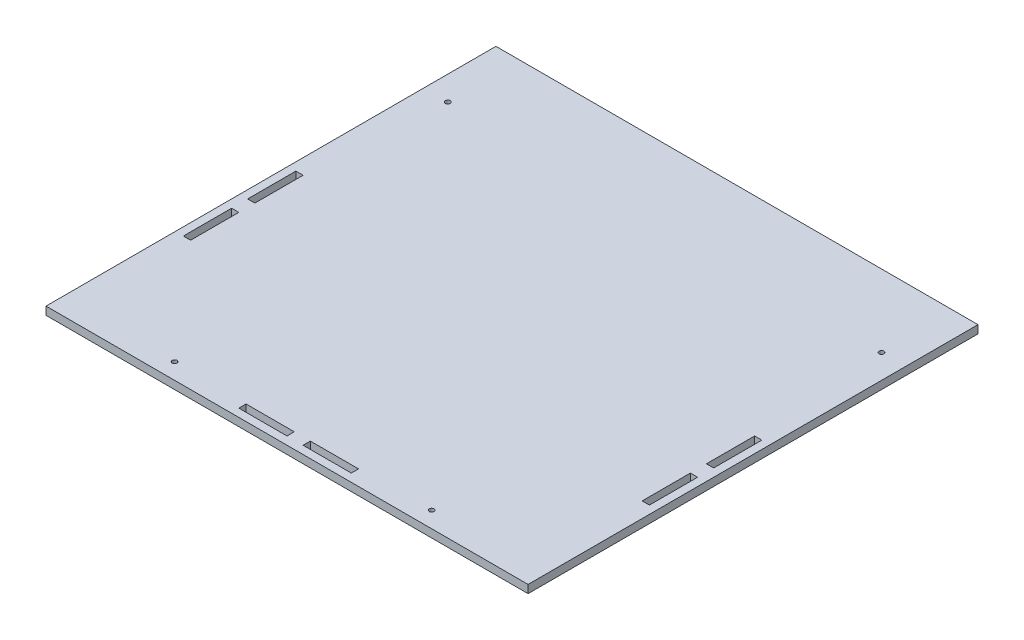
ISO-10303-21;
HEADER;
FILE_DESCRIPTION(('STEP AP214'),'2;1');
FILE_NAME('part.step','',(''),(''),'','','');
FILE_SCHEMA(('AUTOMOTIVE_DESIGN { 1 0 10303 214 1 1 1 1 }'));
ENDSEC;
DATA;
#1=APPLICATION_CONTEXT('core data for automotive mechanical design processes');
#2=APPLICATION_PROTOCOL_DEFINITION('international standard','automotive_design',2000,#1);
#3=PRODUCT_CONTEXT('',#1,'mechanical');
#4=PRODUCT('Part','Part','',(#3));
#5=PRODUCT_RELATED_PRODUCT_CATEGORY('part','',(#4));
#6=PRODUCT_DEFINITION_FORMATION('','',#4);
#7=PRODUCT_DEFINITION_CONTEXT('part definition',#1,'design');
#8=PRODUCT_DEFINITION('design','',#6,#7);
#9=PRODUCT_DEFINITION_SHAPE('','',#8);
#10=(LENGTH_UNIT() NAMED_UNIT(*) SI_UNIT(.MILLI.,.METRE.));
#11=(NAMED_UNIT(*) PLANE_ANGLE_UNIT() SI_UNIT($,.RADIAN.));
#12=(NAMED_UNIT(*) SI_UNIT($,.STERADIAN.) SOLID_ANGLE_UNIT());
#13=UNCERTAINTY_MEASURE_WITH_UNIT(LENGTH_MEASURE(1.E-05),#10,'distance_accuracy_value','');
#14=(GEOMETRIC_REPRESENTATION_CONTEXT(3) GLOBAL_UNCERTAINTY_ASSIGNED_CONTEXT((#13)) GLOBAL_UNIT_ASSIGNED_CONTEXT((#10,
#11,#12)) REPRESENTATION_CONTEXT('',''));
#15=CARTESIAN_POINT('',(0.,0.,0.));
#16=DIRECTION('',(0.,0.,1.));
#17=DIRECTION('',(1.,0.,0.));
#18=AXIS2_PLACEMENT_3D('',#15,#16,#17);
#19=CARTESIAN_POINT('',(0.,5.,0.));
#20=DIRECTION('',(0.,-1.,0.));
#21=DIRECTION('',(0.,0.,-1.));
#22=AXIS2_PLACEMENT_3D('',#19,#20,#21);
#23=PLANE('',#22);
#24=DIRECTION('',(0.,0.,-1.));
#25=VECTOR('',#24,1.);
#26=CARTESIAN_POINT('',(-140.5,5.,29.5));
#27=LINE('',#26,#25);
#28=CARTESIAN_POINT('',(-140.5,5.,59.5));
#29=VERTEX_POINT('',#28);
#30=CARTESIAN_POINT('',(-140.5,5.,29.5));
#31=VERTEX_POINT('',#30);
#32=EDGE_CURVE('E273',#29,#31,#27,.T.);
#33=ORIENTED_EDGE('',*,*,#32,.F.);
#34=DIRECTION('',(1.,0.,0.));
#35=VECTOR('',#34,1.);
#36=CARTESIAN_POINT('',(-140.5,5.,59.5));
#37=LINE('',#36,#35);
#38=CARTESIAN_POINT('',(-145.,5.,59.5));
#39=VERTEX_POINT('',#38);
#40=EDGE_CURVE('E284',#39,#29,#37,.T.);
#41=ORIENTED_EDGE('',*,*,#40,.F.);
#42=DIRECTION('',(0.,0.,1.));
#43=VECTOR('',#42,1.);
#44=CARTESIAN_POINT('',(-145.,5.,29.5));
#45=LINE('',#44,#43);
#46=CARTESIAN_POINT('',(-145.,5.,29.5));
#47=VERTEX_POINT('',#46);
#48=EDGE_CURVE('E280',#47,#39,#45,.T.);
#49=ORIENTED_EDGE('',*,*,#48,.F.);
#50=DIRECTION('',(-1.,0.,0.));
#51=VECTOR('',#50,1.);
#52=CARTESIAN_POINT('',(-140.5,5.,29.5));
#53=LINE('',#52,#51);
#54=EDGE_CURVE('E276',#31,#47,#53,.T.);
#55=ORIENTED_EDGE('',*,*,#54,.F.);
#56=EDGE_LOOP('',(#33,#41,#49,#55));
#57=FACE_BOUND('',#56,.T.);
#58=DIRECTION('',(0.,0.,1.));
#59=VECTOR('',#58,1.);
#60=CARTESIAN_POINT('',(140.5,5.,29.5));
#61=LINE('',#60,#59);
#62=CARTESIAN_POINT('',(140.5,5.,29.5));
#63=VERTEX_POINT('',#62);
#64=CARTESIAN_POINT('',(140.5,5.,59.5));
#65=VERTEX_POINT('',#64);
#66=EDGE_CURVE('E359',#63,#65,#61,.T.);
#67=ORIENTED_EDGE('',*,*,#66,.F.);
#68=DIRECTION('',(-1.,0.,0.));
#69=VECTOR('',#68,1.);
#70=CARTESIAN_POINT('',(140.5,5.,29.5));
#71=LINE('',#70,#69);
#72=CARTESIAN_POINT('',(145.,5.,29.5));
#73=VERTEX_POINT('',#72);
#74=EDGE_CURVE('E370',#73,#63,#71,.T.);
#75=ORIENTED_EDGE('',*,*,#74,.F.);
#76=DIRECTION('',(0.,0.,-1.));
#77=VECTOR('',#76,1.);
#78=CARTESIAN_POINT('',(145.,5.,29.5));
#79=LINE('',#78,#77);
#80=CARTESIAN_POINT('',(145.,5.,59.5));
#81=VERTEX_POINT('',#80);
#82=EDGE_CURVE('E366',#81,#73,#79,.T.);
#83=ORIENTED_EDGE('',*,*,#82,.F.);
#84=DIRECTION('',(1.,0.,0.));
#85=VECTOR('',#84,1.);
#86=CARTESIAN_POINT('',(140.5,5.,59.5));
#87=LINE('',#86,#85);
#88=EDGE_CURVE('E362',#65,#81,#87,.T.);
#89=ORIENTED_EDGE('',*,*,#88,.F.);
#90=EDGE_LOOP('',(#67,#75,#83,#89));
#91=FACE_BOUND('',#90,.T.);
#92=DIRECTION('',(0.,0.,1.));
#93=VECTOR('',#92,1.);
#94=CARTESIAN_POINT('',(5.,5.,130.5));
#95=LINE('',#94,#93);
#96=CARTESIAN_POINT('',(5.,5.,130.5));
#97=VERTEX_POINT('',#96);
#98=CARTESIAN_POINT('',(5.,5.,135.));
#99=VERTEX_POINT('',#98);
#100=EDGE_CURVE('E445',#97,#99,#95,.T.);
#101=ORIENTED_EDGE('',*,*,#100,.F.);
#102=DIRECTION('',(-1.,0.,0.));
#103=VECTOR('',#102,1.);
#104=CARTESIAN_POINT('',(5.,5.,130.5));
#105=LINE('',#104,#103);
#106=CARTESIAN_POINT('',(35.,5.,130.5));
#107=VERTEX_POINT('',#106);
#108=EDGE_CURVE('E456',#107,#97,#105,.T.);
#109=ORIENTED_EDGE('',*,*,#108,.F.);
#110=DIRECTION('',(0.,0.,-1.));
#111=VECTOR('',#110,1.);
#112=CARTESIAN_POINT('',(35.,5.,130.5));
#113=LINE('',#112,#111);
#114=CARTESIAN_POINT('',(35.,5.,135.));
#115=VERTEX_POINT('',#114);
#116=EDGE_CURVE('E452',#115,#107,#113,.T.);
#117=ORIENTED_EDGE('',*,*,#116,.F.);
#118=DIRECTION('',(1.,0.,0.));
#119=VECTOR('',#118,1.);
#120=CARTESIAN_POINT('',(5.,5.,135.));
#121=LINE('',#120,#119);
#122=EDGE_CURVE('E448',#99,#115,#121,.T.);
#123=ORIENTED_EDGE('',*,*,#122,.F.);
#124=EDGE_LOOP('',(#101,#109,#117,#123));
#125=FACE_BOUND('',#124,.T.);
#126=DIRECTION('',(0.,0.,-1.));
#127=VECTOR('',#126,1.);
#128=CARTESIAN_POINT('',(150.,5.,140.));
#129=LINE('',#128,#127);
#130=CARTESIAN_POINT('',(150.,5.,140.));
#131=VERTEX_POINT('',#130);
#132=CARTESIAN_POINT('',(150.,5.,-140.));
#133=VERTEX_POINT('',#132);
#134=EDGE_CURVE('E520',#131,#133,#129,.T.);
#135=ORIENTED_EDGE('',*,*,#134,.T.);
#136=DIRECTION('',(-1.,0.,0.));
#137=VECTOR('',#136,1.);
#138=CARTESIAN_POINT('',(-150.,5.,-140.));
#139=LINE('',#138,#137);
#140=CARTESIAN_POINT('',(-150.,5.,-140.));
#141=VERTEX_POINT('',#140);
#142=EDGE_CURVE('E524',#133,#141,#139,.T.);
#143=ORIENTED_EDGE('',*,*,#142,.T.);
#144=DIRECTION('',(0.,0.,1.));
#145=VECTOR('',#144,1.);
#146=CARTESIAN_POINT('',(-150.,5.,140.));
#147=LINE('',#146,#145);
#148=CARTESIAN_POINT('',(-150.,5.,140.));
#149=VERTEX_POINT('',#148);
#150=EDGE_CURVE('E528',#141,#149,#147,.T.);
#151=ORIENTED_EDGE('',*,*,#150,.T.);
#152=DIRECTION('',(1.,0.,0.));
#153=VECTOR('',#152,1.);
#154=CARTESIAN_POINT('',(-150.,5.,140.));
#155=LINE('',#154,#153);
#156=EDGE_CURVE('E531',#149,#131,#155,.T.);
#157=ORIENTED_EDGE('',*,*,#156,.T.);
#158=EDGE_LOOP('',(#135,#143,#151,#157));
#159=FACE_BOUND('',#158,.T.);
#160=CARTESIAN_POINT('',(-134.97,5.,-95.));
#161=DIRECTION('',(0.,1.,0.));
#162=DIRECTION('',(0.,0.,1.));
#163=AXIS2_PLACEMENT_3D('',#160,#161,#162);
#164=CIRCLE('',#163,1.5);
#165=CARTESIAN_POINT('',(-134.97,5.,-93.5));
#166=VERTEX_POINT('',#165);
#167=EDGE_CURVE('E512',#166,#166,#164,.T.);
#168=ORIENTED_EDGE('',*,*,#167,.F.);
#169=EDGE_LOOP('',(#168));
#170=FACE_BOUND('',#169,.T.);
#171=CARTESIAN_POINT('',(134.97,5.,-95.));
#172=DIRECTION('',(0.,1.,0.));
#173=DIRECTION('',(0.,0.,-1.));
#174=AXIS2_PLACEMENT_3D('',#171,#172,#173);
#175=CIRCLE('',#174,1.5);
#176=CARTESIAN_POINT('',(134.97,5.,-96.5));
#177=VERTEX_POINT('',#176);
#178=EDGE_CURVE('E504',#177,#177,#175,.T.);
#179=ORIENTED_EDGE('',*,*,#178,.F.);
#180=EDGE_LOOP('',(#179));
#181=FACE_BOUND('',#180,.T.);
#182=CARTESIAN_POINT('',(80.,5.,130.));
#183=DIRECTION('',(0.,1.,0.));
#184=DIRECTION('',(0.,0.,1.));
#185=AXIS2_PLACEMENT_3D('',#182,#183,#184);
#186=CIRCLE('',#185,1.5);
#187=CARTESIAN_POINT('',(80.,5.,131.5));
#188=VERTEX_POINT('',#187);
#189=EDGE_CURVE('E496',#188,#188,#186,.T.);
#190=ORIENTED_EDGE('',*,*,#189,.F.);
#191=EDGE_LOOP('',(#190));
#192=FACE_BOUND('',#191,.T.);
#193=CARTESIAN_POINT('',(-80.,5.,130.));
#194=DIRECTION('',(0.,1.,0.));
#195=DIRECTION('',(0.,0.,-1.));
#196=AXIS2_PLACEMENT_3D('',#193,#194,#195);
#197=CIRCLE('',#196,1.5);
#198=CARTESIAN_POINT('',(-80.,5.,128.5));
#199=VERTEX_POINT('',#198);
#200=EDGE_CURVE('E488',#199,#199,#197,.T.);
#201=ORIENTED_EDGE('',*,*,#200,.F.);
#202=EDGE_LOOP('',(#201));
#203=FACE_BOUND('',#202,.T.);
#204=DIRECTION('',(0.,0.,-1.));
#205=VECTOR('',#204,1.);
#206=CARTESIAN_POINT('',(-4.99999999999995,5.,130.5));
#207=LINE('',#206,#205);
#208=CARTESIAN_POINT('',(-4.99999999999995,5.,135.));
#209=VERTEX_POINT('',#208);
#210=CARTESIAN_POINT('',(-4.99999999999995,5.,130.5));
#211=VERTEX_POINT('',#210);
#212=EDGE_CURVE('E402',#209,#211,#207,.T.);
#213=ORIENTED_EDGE('',*,*,#212,.F.);
#214=DIRECTION('',(1.,0.,0.));
#215=VECTOR('',#214,1.);
#216=CARTESIAN_POINT('',(-4.99999999999995,5.,135.));
#217=LINE('',#216,#215);
#218=CARTESIAN_POINT('',(-35.,5.,135.));
#219=VERTEX_POINT('',#218);
#220=EDGE_CURVE('E413',#219,#209,#217,.T.);
#221=ORIENTED_EDGE('',*,*,#220,.F.);
#222=DIRECTION('',(0.,0.,1.));
#223=VECTOR('',#222,1.);
#224=CARTESIAN_POINT('',(-35.,5.,130.5));
#225=LINE('',#224,#223);
#226=CARTESIAN_POINT('',(-35.,5.,130.5));
#227=VERTEX_POINT('',#226);
#228=EDGE_CURVE('E409',#227,#219,#225,.T.);
#229=ORIENTED_EDGE('',*,*,#228,.F.);
#230=DIRECTION('',(-1.,0.,0.));
#231=VECTOR('',#230,1.);
#232=CARTESIAN_POINT('',(-4.99999999999995,5.,130.5));
#233=LINE('',#232,#231);
#234=EDGE_CURVE('E405',#211,#227,#233,.T.);
#235=ORIENTED_EDGE('',*,*,#234,.F.);
#236=EDGE_LOOP('',(#213,#221,#229,#235));
#237=FACE_BOUND('',#236,.T.);
#238=DIRECTION('',(0.,0.,1.));
#239=VECTOR('',#238,1.);
#240=CARTESIAN_POINT('',(140.5,5.,19.5));
#241=LINE('',#240,#239);
#242=CARTESIAN_POINT('',(140.5,5.,-10.5));
#243=VERTEX_POINT('',#242);
#244=CARTESIAN_POINT('',(140.5,5.,19.5));
#245=VERTEX_POINT('',#244);
#246=EDGE_CURVE('E316',#243,#245,#241,.T.);
#247=ORIENTED_EDGE('',*,*,#246,.F.);
#248=DIRECTION('',(-1.,0.,0.));
#249=VECTOR('',#248,1.);
#250=CARTESIAN_POINT('',(140.5,5.,-10.5));
#251=LINE('',#250,#249);
#252=CARTESIAN_POINT('',(145.,5.,-10.5));
#253=VERTEX_POINT('',#252);
#254=EDGE_CURVE('E327',#253,#243,#251,.T.);
#255=ORIENTED_EDGE('',*,*,#254,.F.);
#256=DIRECTION('',(0.,0.,-1.));
#257=VECTOR('',#256,1.);
#258=CARTESIAN_POINT('',(145.,5.,19.5));
#259=LINE('',#258,#257);
#260=CARTESIAN_POINT('',(145.,5.,19.5));
#261=VERTEX_POINT('',#260);
#262=EDGE_CURVE('E323',#261,#253,#259,.T.);
#263=ORIENTED_EDGE('',*,*,#262,.F.);
#264=DIRECTION('',(1.,0.,0.));
#265=VECTOR('',#264,1.);
#266=CARTESIAN_POINT('',(140.5,5.,19.5));
#267=LINE('',#266,#265);
#268=EDGE_CURVE('E319',#245,#261,#267,.T.);
#269=ORIENTED_EDGE('',*,*,#268,.F.);
#270=EDGE_LOOP('',(#247,#255,#263,#269));
#271=FACE_BOUND('',#270,.T.);
#272=DIRECTION('',(1.,0.,0.));
#273=VECTOR('',#272,1.);
#274=CARTESIAN_POINT('',(-140.5,5.,19.5));
#275=LINE('',#274,#273);
#276=CARTESIAN_POINT('',(-145.,5.,19.5));
#277=VERTEX_POINT('',#276);
#278=CARTESIAN_POINT('',(-140.5,5.,19.5));
#279=VERTEX_POINT('',#278);
#280=EDGE_CURVE('E225',#277,#279,#275,.T.);
#281=ORIENTED_EDGE('',*,*,#280,.F.);
#282=DIRECTION('',(0.,0.,1.));
#283=VECTOR('',#282,1.);
#284=CARTESIAN_POINT('',(-145.,5.,19.5));
#285=LINE('',#284,#283);
#286=CARTESIAN_POINT('',(-145.,5.,-10.5));
#287=VERTEX_POINT('',#286);
#288=EDGE_CURVE('E251',#287,#277,#285,.T.);
#289=ORIENTED_EDGE('',*,*,#288,.F.);
#290=DIRECTION('',(-1.,0.,0.));
#291=VECTOR('',#290,1.);
#292=CARTESIAN_POINT('',(-140.5,5.,-10.5));
#293=LINE('',#292,#291);
#294=CARTESIAN_POINT('',(-140.5,5.,-10.5));
#295=VERTEX_POINT('',#294);
#296=EDGE_CURVE('E247',#295,#287,#293,.T.);
#297=ORIENTED_EDGE('',*,*,#296,.F.);
#298=DIRECTION('',(0.,0.,-1.));
#299=VECTOR('',#298,1.);
#300=CARTESIAN_POINT('',(-140.5,5.,19.5));
#301=LINE('',#300,#299);
#302=EDGE_CURVE('E234',#279,#295,#301,.T.);
#303=ORIENTED_EDGE('',*,*,#302,.F.);
#304=EDGE_LOOP('',(#281,#289,#297,#303));
#305=FACE_BOUND('',#304,.T.);
#306=ADVANCED_FACE('F39',(#57,#91,#125,#159,#170,#181,#192,#203,#237,#271,#305),#23,.F.);
#307=CARTESIAN_POINT('',(0.,0.,0.));
#308=DIRECTION('',(0.,-1.,0.));
#309=DIRECTION('',(0.,0.,-1.));
#310=AXIS2_PLACEMENT_3D('',#307,#308,#309);
#311=PLANE('',#310);
#312=CARTESIAN_POINT('',(80.,0.,130.));
#313=DIRECTION('',(0.,1.,0.));
#314=DIRECTION('',(0.,0.,1.));
#315=AXIS2_PLACEMENT_3D('',#312,#313,#314);
#316=CIRCLE('',#315,1.5);
#317=CARTESIAN_POINT('',(80.,0.,131.5));
#318=VERTEX_POINT('',#317);
#319=EDGE_CURVE('E492',#318,#318,#316,.T.);
#320=ORIENTED_EDGE('',*,*,#319,.T.);
#321=EDGE_LOOP('',(#320));
#322=FACE_BOUND('',#321,.T.);
#323=CARTESIAN_POINT('',(-134.97,0.,-95.));
#324=DIRECTION('',(0.,1.,0.));
#325=DIRECTION('',(0.,0.,1.));
#326=AXIS2_PLACEMENT_3D('',#323,#324,#325);
#327=CIRCLE('',#326,1.5);
#328=CARTESIAN_POINT('',(-134.97,0.,-93.5));
#329=VERTEX_POINT('',#328);
#330=EDGE_CURVE('E508',#329,#329,#327,.T.);
#331=ORIENTED_EDGE('',*,*,#330,.T.);
#332=EDGE_LOOP('',(#331));
#333=FACE_BOUND('',#332,.T.);
#334=DIRECTION('',(0.,0.,-1.));
#335=VECTOR('',#334,1.);
#336=CARTESIAN_POINT('',(150.,0.,140.));
#337=LINE('',#336,#335);
#338=CARTESIAN_POINT('',(150.,0.,140.));
#339=VERTEX_POINT('',#338);
#340=CARTESIAN_POINT('',(150.,0.,-140.));
#341=VERTEX_POINT('',#340);
#342=EDGE_CURVE('E516',#339,#341,#337,.T.);
#343=ORIENTED_EDGE('',*,*,#342,.F.);
#344=DIRECTION('',(1.,0.,0.));
#345=VECTOR('',#344,1.);
#346=CARTESIAN_POINT('',(-150.,0.,140.));
#347=LINE('',#346,#345);
#348=CARTESIAN_POINT('',(-150.,0.,140.));
#349=VERTEX_POINT('',#348);
#350=EDGE_CURVE('E525',#349,#339,#347,.T.);
#351=ORIENTED_EDGE('',*,*,#350,.F.);
#352=DIRECTION('',(0.,0.,1.));
#353=VECTOR('',#352,1.);
#354=CARTESIAN_POINT('',(-150.,0.,140.));
#355=LINE('',#354,#353);
#356=CARTESIAN_POINT('',(-150.,0.,-140.));
#357=VERTEX_POINT('',#356);
#358=EDGE_CURVE('E541',#357,#349,#355,.T.);
#359=ORIENTED_EDGE('',*,*,#358,.F.);
#360=DIRECTION('',(-1.,0.,0.));
#361=VECTOR('',#360,1.);
#362=CARTESIAN_POINT('',(-150.,0.,-140.));
#363=LINE('',#362,#361);
#364=EDGE_CURVE('E538',#341,#357,#363,.T.);
#365=ORIENTED_EDGE('',*,*,#364,.F.);
#366=EDGE_LOOP('',(#343,#351,#359,#365));
#367=FACE_BOUND('',#366,.T.);
#368=CARTESIAN_POINT('',(134.97,0.,-95.));
#369=DIRECTION('',(0.,1.,0.));
#370=DIRECTION('',(0.,0.,-1.));
#371=AXIS2_PLACEMENT_3D('',#368,#369,#370);
#372=CIRCLE('',#371,1.5);
#373=CARTESIAN_POINT('',(134.97,0.,-96.5));
#374=VERTEX_POINT('',#373);
#375=EDGE_CURVE('E500',#374,#374,#372,.T.);
#376=ORIENTED_EDGE('',*,*,#375,.T.);
#377=EDGE_LOOP('',(#376));
#378=FACE_BOUND('',#377,.T.);
#379=CARTESIAN_POINT('',(-80.,0.,130.));
#380=DIRECTION('',(0.,1.,0.));
#381=DIRECTION('',(0.,0.,-1.));
#382=AXIS2_PLACEMENT_3D('',#379,#380,#381);
#383=CIRCLE('',#382,1.5);
#384=CARTESIAN_POINT('',(-80.,0.,128.5));
#385=VERTEX_POINT('',#384);
#386=EDGE_CURVE('E487',#385,#385,#383,.T.);
#387=ORIENTED_EDGE('',*,*,#386,.T.);
#388=EDGE_LOOP('',(#387));
#389=FACE_BOUND('',#388,.T.);
#390=DIRECTION('',(-1.,0.,0.));
#391=VECTOR('',#390,1.);
#392=CARTESIAN_POINT('',(5.,0.,130.5));
#393=LINE('',#392,#391);
#394=CARTESIAN_POINT('',(35.,0.,130.5));
#395=VERTEX_POINT('',#394);
#396=CARTESIAN_POINT('',(5.,0.,130.5));
#397=VERTEX_POINT('',#396);
#398=EDGE_CURVE('E449',#395,#397,#393,.T.);
#399=ORIENTED_EDGE('',*,*,#398,.T.);
#400=DIRECTION('',(0.,0.,1.));
#401=VECTOR('',#400,1.);
#402=CARTESIAN_POINT('',(5.,0.,130.5));
#403=LINE('',#402,#401);
#404=CARTESIAN_POINT('',(5.,0.,135.));
#405=VERTEX_POINT('',#404);
#406=EDGE_CURVE('E444',#397,#405,#403,.T.);
#407=ORIENTED_EDGE('',*,*,#406,.T.);
#408=DIRECTION('',(1.,0.,0.));
#409=VECTOR('',#408,1.);
#410=CARTESIAN_POINT('',(5.,0.,135.));
#411=LINE('',#410,#409);
#412=CARTESIAN_POINT('',(35.,0.,135.));
#413=VERTEX_POINT('',#412);
#414=EDGE_CURVE('E463',#405,#413,#411,.T.);
#415=ORIENTED_EDGE('',*,*,#414,.T.);
#416=DIRECTION('',(0.,0.,-1.));
#417=VECTOR('',#416,1.);
#418=CARTESIAN_POINT('',(35.,0.,130.5));
#419=LINE('',#418,#417);
#420=EDGE_CURVE('E467',#413,#395,#419,.T.);
#421=ORIENTED_EDGE('',*,*,#420,.T.);
#422=EDGE_LOOP('',(#399,#407,#415,#421));
#423=FACE_BOUND('',#422,.T.);
#424=DIRECTION('',(1.,0.,0.));
#425=VECTOR('',#424,1.);
#426=CARTESIAN_POINT('',(-4.99999999999995,0.,135.));
#427=LINE('',#426,#425);
#428=CARTESIAN_POINT('',(-35.,0.,135.));
#429=VERTEX_POINT('',#428);
#430=CARTESIAN_POINT('',(-4.99999999999995,0.,135.));
#431=VERTEX_POINT('',#430);
#432=EDGE_CURVE('E406',#429,#431,#427,.T.);
#433=ORIENTED_EDGE('',*,*,#432,.T.);
#434=DIRECTION('',(0.,0.,-1.));
#435=VECTOR('',#434,1.);
#436=CARTESIAN_POINT('',(-4.99999999999995,0.,130.5));
#437=LINE('',#436,#435);
#438=CARTESIAN_POINT('',(-4.99999999999995,0.,130.5));
#439=VERTEX_POINT('',#438);
#440=EDGE_CURVE('E401',#431,#439,#437,.T.);
#441=ORIENTED_EDGE('',*,*,#440,.T.);
#442=DIRECTION('',(-1.,0.,0.));
#443=VECTOR('',#442,1.);
#444=CARTESIAN_POINT('',(-4.99999999999995,0.,130.5));
#445=LINE('',#444,#443);
#446=CARTESIAN_POINT('',(-35.,0.,130.5));
#447=VERTEX_POINT('',#446);
#448=EDGE_CURVE('E420',#439,#447,#445,.T.);
#449=ORIENTED_EDGE('',*,*,#448,.T.);
#450=DIRECTION('',(0.,0.,1.));
#451=VECTOR('',#450,1.);
#452=CARTESIAN_POINT('',(-35.,0.,130.5));
#453=LINE('',#452,#451);
#454=EDGE_CURVE('E424',#447,#429,#453,.T.);
#455=ORIENTED_EDGE('',*,*,#454,.T.);
#456=EDGE_LOOP('',(#433,#441,#449,#455));
#457=FACE_BOUND('',#456,.T.);
#458=DIRECTION('',(-1.,0.,0.));
#459=VECTOR('',#458,1.);
#460=CARTESIAN_POINT('',(140.5,0.,29.5));
#461=LINE('',#460,#459);
#462=CARTESIAN_POINT('',(145.,0.,29.5));
#463=VERTEX_POINT('',#462);
#464=CARTESIAN_POINT('',(140.5,0.,29.5));
#465=VERTEX_POINT('',#464);
#466=EDGE_CURVE('E363',#463,#465,#461,.T.);
#467=ORIENTED_EDGE('',*,*,#466,.T.);
#468=DIRECTION('',(0.,0.,1.));
#469=VECTOR('',#468,1.);
#470=CARTESIAN_POINT('',(140.5,0.,29.5));
#471=LINE('',#470,#469);
#472=CARTESIAN_POINT('',(140.5,0.,59.5));
#473=VERTEX_POINT('',#472);
#474=EDGE_CURVE('E358',#465,#473,#471,.T.);
#475=ORIENTED_EDGE('',*,*,#474,.T.);
#476=DIRECTION('',(1.,0.,0.));
#477=VECTOR('',#476,1.);
#478=CARTESIAN_POINT('',(140.5,0.,59.5));
#479=LINE('',#478,#477);
#480=CARTESIAN_POINT('',(145.,0.,59.5));
#481=VERTEX_POINT('',#480);
#482=EDGE_CURVE('E377',#473,#481,#479,.T.);
#483=ORIENTED_EDGE('',*,*,#482,.T.);
#484=DIRECTION('',(0.,0.,-1.));
#485=VECTOR('',#484,1.);
#486=CARTESIAN_POINT('',(145.,0.,29.5));
#487=LINE('',#486,#485);
#488=EDGE_CURVE('E381',#481,#463,#487,.T.);
#489=ORIENTED_EDGE('',*,*,#488,.T.);
#490=EDGE_LOOP('',(#467,#475,#483,#489));
#491=FACE_BOUND('',#490,.T.);
#492=DIRECTION('',(-1.,0.,0.));
#493=VECTOR('',#492,1.);
#494=CARTESIAN_POINT('',(140.5,0.,-10.5));
#495=LINE('',#494,#493);
#496=CARTESIAN_POINT('',(145.,0.,-10.5));
#497=VERTEX_POINT('',#496);
#498=CARTESIAN_POINT('',(140.5,0.,-10.5));
#499=VERTEX_POINT('',#498);
#500=EDGE_CURVE('E320',#497,#499,#495,.T.);
#501=ORIENTED_EDGE('',*,*,#500,.T.);
#502=DIRECTION('',(0.,0.,1.));
#503=VECTOR('',#502,1.);
#504=CARTESIAN_POINT('',(140.5,0.,19.5));
#505=LINE('',#504,#503);
#506=CARTESIAN_POINT('',(140.5,0.,19.5));
#507=VERTEX_POINT('',#506);
#508=EDGE_CURVE('E315',#499,#507,#505,.T.);
#509=ORIENTED_EDGE('',*,*,#508,.T.);
#510=DIRECTION('',(1.,0.,0.));
#511=VECTOR('',#510,1.);
#512=CARTESIAN_POINT('',(140.5,0.,19.5));
#513=LINE('',#512,#511);
#514=CARTESIAN_POINT('',(145.,0.,19.5));
#515=VERTEX_POINT('',#514);
#516=EDGE_CURVE('E334',#507,#515,#513,.T.);
#517=ORIENTED_EDGE('',*,*,#516,.T.);
#518=DIRECTION('',(0.,0.,-1.));
#519=VECTOR('',#518,1.);
#520=CARTESIAN_POINT('',(145.,0.,19.5));
#521=LINE('',#520,#519);
#522=EDGE_CURVE('E338',#515,#497,#521,.T.);
#523=ORIENTED_EDGE('',*,*,#522,.T.);
#524=EDGE_LOOP('',(#501,#509,#517,#523));
#525=FACE_BOUND('',#524,.T.);
#526=DIRECTION('',(1.,0.,0.));
#527=VECTOR('',#526,1.);
#528=CARTESIAN_POINT('',(-140.5,0.,59.5));
#529=LINE('',#528,#527);
#530=CARTESIAN_POINT('',(-145.,0.,59.5));
#531=VERTEX_POINT('',#530);
#532=CARTESIAN_POINT('',(-140.5,0.,59.5));
#533=VERTEX_POINT('',#532);
#534=EDGE_CURVE('E277',#531,#533,#529,.T.);
#535=ORIENTED_EDGE('',*,*,#534,.T.);
#536=DIRECTION('',(0.,0.,-1.));
#537=VECTOR('',#536,1.);
#538=CARTESIAN_POINT('',(-140.5,0.,29.5));
#539=LINE('',#538,#537);
#540=CARTESIAN_POINT('',(-140.5,0.,29.5));
#541=VERTEX_POINT('',#540);
#542=EDGE_CURVE('E243',#533,#541,#539,.T.);
#543=ORIENTED_EDGE('',*,*,#542,.T.);
#544=DIRECTION('',(-1.,0.,0.));
#545=VECTOR('',#544,1.);
#546=CARTESIAN_POINT('',(-140.5,0.,29.5));
#547=LINE('',#546,#545);
#548=CARTESIAN_POINT('',(-145.,0.,29.5));
#549=VERTEX_POINT('',#548);
#550=EDGE_CURVE('E291',#541,#549,#547,.T.);
#551=ORIENTED_EDGE('',*,*,#550,.T.);
#552=DIRECTION('',(0.,0.,1.));
#553=VECTOR('',#552,1.);
#554=CARTESIAN_POINT('',(-145.,0.,29.5));
#555=LINE('',#554,#553);
#556=EDGE_CURVE('E295',#549,#531,#555,.T.);
#557=ORIENTED_EDGE('',*,*,#556,.T.);
#558=EDGE_LOOP('',(#535,#543,#551,#557));
#559=FACE_BOUND('',#558,.T.);
#560=DIRECTION('',(0.,0.,1.));
#561=VECTOR('',#560,1.);
#562=CARTESIAN_POINT('',(-145.,0.,19.5));
#563=LINE('',#562,#561);
#564=CARTESIAN_POINT('',(-145.,0.,-10.5));
#565=VERTEX_POINT('',#564);
#566=CARTESIAN_POINT('',(-145.,0.,19.5));
#567=VERTEX_POINT('',#566);
#568=EDGE_CURVE('E235',#565,#567,#563,.T.);
#569=ORIENTED_EDGE('',*,*,#568,.T.);
#570=DIRECTION('',(1.,0.,0.));
#571=VECTOR('',#570,1.);
#572=CARTESIAN_POINT('',(-140.5,0.,19.5));
#573=LINE('',#572,#571);
#574=CARTESIAN_POINT('',(-140.5,0.,19.5));
#575=VERTEX_POINT('',#574);
#576=EDGE_CURVE('E63',#567,#575,#573,.T.);
#577=ORIENTED_EDGE('',*,*,#576,.T.);
#578=DIRECTION('',(0.,0.,-1.));
#579=VECTOR('',#578,1.);
#580=CARTESIAN_POINT('',(-140.5,0.,19.5));
#581=LINE('',#580,#579);
#582=CARTESIAN_POINT('',(-140.5,0.,-10.5));
#583=VERTEX_POINT('',#582);
#584=EDGE_CURVE('E241',#575,#583,#581,.T.);
#585=ORIENTED_EDGE('',*,*,#584,.T.);
#586=DIRECTION('',(-1.,0.,0.));
#587=VECTOR('',#586,1.);
#588=CARTESIAN_POINT('',(-140.5,0.,-10.5));
#589=LINE('',#588,#587);
#590=EDGE_CURVE('E260',#583,#565,#589,.T.);
#591=ORIENTED_EDGE('',*,*,#590,.T.);
#592=EDGE_LOOP('',(#569,#577,#585,#591));
#593=FACE_BOUND('',#592,.T.);
#594=ADVANCED_FACE('F564',(#322,#333,#367,#378,#389,#423,#457,#491,#525,#559,#593),#311,.T.);
#595=CARTESIAN_POINT('',(150.,5.,140.));
#596=DIRECTION('',(-1.,0.,0.));
#597=DIRECTION('',(0.,0.,1.));
#598=AXIS2_PLACEMENT_3D('',#595,#596,#597);
#599=PLANE('',#598);
#600=ORIENTED_EDGE('',*,*,#342,.T.);
#601=DIRECTION('',(0.,-1.,0.));
#602=VECTOR('',#601,1.);
#603=CARTESIAN_POINT('',(150.,5.,-140.));
#604=LINE('',#603,#602);
#605=EDGE_CURVE('E11',#133,#341,#604,.T.);
#606=ORIENTED_EDGE('',*,*,#605,.F.);
#607=ORIENTED_EDGE('',*,*,#134,.F.);
#608=DIRECTION('',(0.,-1.,0.));
#609=VECTOR('',#608,1.);
#610=CARTESIAN_POINT('',(150.,5.,140.));
#611=LINE('',#610,#609);
#612=EDGE_CURVE('E534',#131,#339,#611,.T.);
#613=ORIENTED_EDGE('',*,*,#612,.T.);
#614=EDGE_LOOP('',(#600,#606,#607,#613));
#615=FACE_BOUND('',#614,.T.);
#616=ADVANCED_FACE('F41',(#615),#599,.F.);
#617=CARTESIAN_POINT('',(-150.,5.,-140.));
#618=DIRECTION('',(0.,0.,1.));
#619=DIRECTION('',(1.,0.,0.));
#620=AXIS2_PLACEMENT_3D('',#617,#618,#619);
#621=PLANE('',#620);
#622=ORIENTED_EDGE('',*,*,#364,.T.);
#623=DIRECTION('',(0.,-1.,0.));
#624=VECTOR('',#623,1.);
#625=CARTESIAN_POINT('',(-150.,5.,-140.));
#626=LINE('',#625,#624);
#627=EDGE_CURVE('E48',#141,#357,#626,.T.);
#628=ORIENTED_EDGE('',*,*,#627,.F.);
#629=ORIENTED_EDGE('',*,*,#142,.F.);
#630=ORIENTED_EDGE('',*,*,#605,.T.);
#631=EDGE_LOOP('',(#622,#628,#629,#630));
#632=FACE_BOUND('',#631,.T.);
#633=ADVANCED_FACE('F575',(#632),#621,.F.);
#634=CARTESIAN_POINT('',(-150.,5.,140.));
#635=DIRECTION('',(1.,0.,0.));
#636=DIRECTION('',(0.,0.,-1.));
#637=AXIS2_PLACEMENT_3D('',#634,#635,#636);
#638=PLANE('',#637);
#639=ORIENTED_EDGE('',*,*,#358,.T.);
#640=DIRECTION('',(0.,-1.,0.));
#641=VECTOR('',#640,1.);
#642=CARTESIAN_POINT('',(-150.,5.,140.));
#643=LINE('',#642,#641);
#644=EDGE_CURVE('E549',#149,#349,#643,.T.);
#645=ORIENTED_EDGE('',*,*,#644,.F.);
#646=ORIENTED_EDGE('',*,*,#150,.F.);
#647=ORIENTED_EDGE('',*,*,#627,.T.);
#648=EDGE_LOOP('',(#639,#645,#646,#647));
#649=FACE_BOUND('',#648,.T.);
#650=ADVANCED_FACE('F558',(#649),#638,.F.);
#651=CARTESIAN_POINT('',(-150.,5.,140.));
#652=DIRECTION('',(0.,0.,-1.));
#653=DIRECTION('',(-1.,0.,0.));
#654=AXIS2_PLACEMENT_3D('',#651,#652,#653);
#655=PLANE('',#654);
#656=ORIENTED_EDGE('',*,*,#350,.T.);
#657=ORIENTED_EDGE('',*,*,#612,.F.);
#658=ORIENTED_EDGE('',*,*,#156,.F.);
#659=ORIENTED_EDGE('',*,*,#644,.T.);
#660=EDGE_LOOP('',(#656,#657,#658,#659));
#661=FACE_BOUND('',#660,.T.);
#662=ADVANCED_FACE('F568',(#661),#655,.F.);
#663=CARTESIAN_POINT('',(-134.97,5.,-95.));
#664=DIRECTION('',(0.,-1.,0.));
#665=DIRECTION('',(0.,0.,-1.));
#666=AXIS2_PLACEMENT_3D('',#663,#664,#665);
#667=CYLINDRICAL_SURFACE('',#666,1.5);
#668=ORIENTED_EDGE('',*,*,#167,.T.);
#669=EDGE_LOOP('',(#668));
#670=FACE_BOUND('',#669,.T.);
#671=ORIENTED_EDGE('',*,*,#330,.F.);
#672=EDGE_LOOP('',(#671));
#673=FACE_BOUND('',#672,.T.);
#674=ADVANCED_FACE('F593',(#670,#673),#667,.F.);
#675=CARTESIAN_POINT('',(134.97,5.,-95.));
#676=DIRECTION('',(0.,-1.,0.));
#677=DIRECTION('',(0.,0.,-1.));
#678=AXIS2_PLACEMENT_3D('',#675,#676,#677);
#679=CYLINDRICAL_SURFACE('',#678,1.5);
#680=ORIENTED_EDGE('',*,*,#178,.T.);
#681=EDGE_LOOP('',(#680));
#682=FACE_BOUND('',#681,.T.);
#683=ORIENTED_EDGE('',*,*,#375,.F.);
#684=EDGE_LOOP('',(#683));
#685=FACE_BOUND('',#684,.T.);
#686=ADVANCED_FACE('F600',(#682,#685),#679,.F.);
#687=CARTESIAN_POINT('',(80.,5.,130.));
#688=DIRECTION('',(0.,-1.,0.));
#689=DIRECTION('',(0.,0.,-1.));
#690=AXIS2_PLACEMENT_3D('',#687,#688,#689);
#691=CYLINDRICAL_SURFACE('',#690,1.5);
#692=ORIENTED_EDGE('',*,*,#189,.T.);
#693=EDGE_LOOP('',(#692));
#694=FACE_BOUND('',#693,.T.);
#695=ORIENTED_EDGE('',*,*,#319,.F.);
#696=EDGE_LOOP('',(#695));
#697=FACE_BOUND('',#696,.T.);
#698=ADVANCED_FACE('F605',(#694,#697),#691,.F.);
#699=CARTESIAN_POINT('',(-80.,5.,130.));
#700=DIRECTION('',(0.,-1.,0.));
#701=DIRECTION('',(0.,0.,-1.));
#702=AXIS2_PLACEMENT_3D('',#699,#700,#701);
#703=CYLINDRICAL_SURFACE('',#702,1.5);
#704=ORIENTED_EDGE('',*,*,#200,.T.);
#705=EDGE_LOOP('',(#704));
#706=FACE_BOUND('',#705,.T.);
#707=ORIENTED_EDGE('',*,*,#386,.F.);
#708=EDGE_LOOP('',(#707));
#709=FACE_BOUND('',#708,.T.);
#710=ADVANCED_FACE('F701',(#706,#709),#703,.F.);
#711=CARTESIAN_POINT('',(5.,5.,130.5));
#712=DIRECTION('',(1.,0.,0.));
#713=DIRECTION('',(0.,0.,-1.));
#714=AXIS2_PLACEMENT_3D('',#711,#712,#713);
#715=PLANE('',#714);
#716=ORIENTED_EDGE('',*,*,#406,.F.);
#717=DIRECTION('',(0.,-1.,0.));
#718=VECTOR('',#717,1.);
#719=CARTESIAN_POINT('',(5.,5.,130.5));
#720=LINE('',#719,#718);
#721=EDGE_CURVE('E459',#97,#397,#720,.T.);
#722=ORIENTED_EDGE('',*,*,#721,.F.);
#723=ORIENTED_EDGE('',*,*,#100,.T.);
#724=DIRECTION('',(0.,-1.,0.));
#725=VECTOR('',#724,1.);
#726=CARTESIAN_POINT('',(5.,5.,135.));
#727=LINE('',#726,#725);
#728=EDGE_CURVE('E483',#99,#405,#727,.T.);
#729=ORIENTED_EDGE('',*,*,#728,.T.);
#730=EDGE_LOOP('',(#716,#722,#723,#729));
#731=FACE_BOUND('',#730,.T.);
#732=ADVANCED_FACE('F697',(#731),#715,.T.);
#733=CARTESIAN_POINT('',(5.,5.,135.));
#734=DIRECTION('',(0.,0.,-1.));
#735=DIRECTION('',(-1.,0.,0.));
#736=AXIS2_PLACEMENT_3D('',#733,#734,#735);
#737=PLANE('',#736);
#738=ORIENTED_EDGE('',*,*,#414,.F.);
#739=ORIENTED_EDGE('',*,*,#728,.F.);
#740=ORIENTED_EDGE('',*,*,#122,.T.);
#741=DIRECTION('',(0.,-1.,0.));
#742=VECTOR('',#741,1.);
#743=CARTESIAN_POINT('',(35.,5.,135.));
#744=LINE('',#743,#742);
#745=EDGE_CURVE('E480',#115,#413,#744,.T.);
#746=ORIENTED_EDGE('',*,*,#745,.T.);
#747=EDGE_LOOP('',(#738,#739,#740,#746));
#748=FACE_BOUND('',#747,.T.);
#749=ADVANCED_FACE('F693',(#748),#737,.T.);
#750=CARTESIAN_POINT('',(35.,5.,130.5));
#751=DIRECTION('',(-1.,0.,0.));
#752=DIRECTION('',(0.,0.,1.));
#753=AXIS2_PLACEMENT_3D('',#750,#751,#752);
#754=PLANE('',#753);
#755=ORIENTED_EDGE('',*,*,#420,.F.);
#756=ORIENTED_EDGE('',*,*,#745,.F.);
#757=ORIENTED_EDGE('',*,*,#116,.T.);
#758=DIRECTION('',(0.,-1.,0.));
#759=VECTOR('',#758,1.);
#760=CARTESIAN_POINT('',(35.,5.,130.5));
#761=LINE('',#760,#759);
#762=EDGE_CURVE('E477',#107,#395,#761,.T.);
#763=ORIENTED_EDGE('',*,*,#762,.T.);
#764=EDGE_LOOP('',(#755,#756,#757,#763));
#765=FACE_BOUND('',#764,.T.);
#766=ADVANCED_FACE('F689',(#765),#754,.T.);
#767=CARTESIAN_POINT('',(5.,5.,130.5));
#768=DIRECTION('',(0.,0.,1.));
#769=DIRECTION('',(1.,0.,0.));
#770=AXIS2_PLACEMENT_3D('',#767,#768,#769);
#771=PLANE('',#770);
#772=ORIENTED_EDGE('',*,*,#398,.F.);
#773=ORIENTED_EDGE('',*,*,#762,.F.);
#774=ORIENTED_EDGE('',*,*,#108,.T.);
#775=ORIENTED_EDGE('',*,*,#721,.T.);
#776=EDGE_LOOP('',(#772,#773,#774,#775));
#777=FACE_BOUND('',#776,.T.);
#778=ADVANCED_FACE('F685',(#777),#771,.T.);
#779=CARTESIAN_POINT('',(-4.99999999999995,5.,130.5));
#780=DIRECTION('',(-1.,0.,0.));
#781=DIRECTION('',(0.,0.,1.));
#782=AXIS2_PLACEMENT_3D('',#779,#780,#781);
#783=PLANE('',#782);
#784=ORIENTED_EDGE('',*,*,#440,.F.);
#785=DIRECTION('',(0.,-1.,0.));
#786=VECTOR('',#785,1.);
#787=CARTESIAN_POINT('',(-4.99999999999995,5.,135.));
#788=LINE('',#787,#786);
#789=EDGE_CURVE('E416',#209,#431,#788,.T.);
#790=ORIENTED_EDGE('',*,*,#789,.F.);
#791=ORIENTED_EDGE('',*,*,#212,.T.);
#792=DIRECTION('',(0.,-1.,0.));
#793=VECTOR('',#792,1.);
#794=CARTESIAN_POINT('',(-4.99999999999995,5.,130.5));
#795=LINE('',#794,#793);
#796=EDGE_CURVE('E440',#211,#439,#795,.T.);
#797=ORIENTED_EDGE('',*,*,#796,.T.);
#798=EDGE_LOOP('',(#784,#790,#791,#797));
#799=FACE_BOUND('',#798,.T.);
#800=ADVANCED_FACE('F681',(#799),#783,.T.);
#801=CARTESIAN_POINT('',(-4.99999999999995,5.,130.5));
#802=DIRECTION('',(0.,0.,1.));
#803=DIRECTION('',(1.,0.,0.));
#804=AXIS2_PLACEMENT_3D('',#801,#802,#803);
#805=PLANE('',#804);
#806=ORIENTED_EDGE('',*,*,#448,.F.);
#807=ORIENTED_EDGE('',*,*,#796,.F.);
#808=ORIENTED_EDGE('',*,*,#234,.T.);
#809=DIRECTION('',(0.,-1.,0.));
#810=VECTOR('',#809,1.);
#811=CARTESIAN_POINT('',(-35.,5.,130.5));
#812=LINE('',#811,#810);
#813=EDGE_CURVE('E437',#227,#447,#812,.T.);
#814=ORIENTED_EDGE('',*,*,#813,.T.);
#815=EDGE_LOOP('',(#806,#807,#808,#814));
#816=FACE_BOUND('',#815,.T.);
#817=ADVANCED_FACE('F677',(#816),#805,.T.);
#818=CARTESIAN_POINT('',(-35.,5.,130.5));
#819=DIRECTION('',(1.,0.,0.));
#820=DIRECTION('',(0.,0.,-1.));
#821=AXIS2_PLACEMENT_3D('',#818,#819,#820);
#822=PLANE('',#821);
#823=ORIENTED_EDGE('',*,*,#454,.F.);
#824=ORIENTED_EDGE('',*,*,#813,.F.);
#825=ORIENTED_EDGE('',*,*,#228,.T.);
#826=DIRECTION('',(0.,-1.,0.));
#827=VECTOR('',#826,1.);
#828=CARTESIAN_POINT('',(-35.,5.,135.));
#829=LINE('',#828,#827);
#830=EDGE_CURVE('E434',#219,#429,#829,.T.);
#831=ORIENTED_EDGE('',*,*,#830,.T.);
#832=EDGE_LOOP('',(#823,#824,#825,#831));
#833=FACE_BOUND('',#832,.T.);
#834=ADVANCED_FACE('F673',(#833),#822,.T.);
#835=CARTESIAN_POINT('',(-4.99999999999995,5.,135.));
#836=DIRECTION('',(0.,0.,-1.));
#837=DIRECTION('',(-1.,0.,0.));
#838=AXIS2_PLACEMENT_3D('',#835,#836,#837);
#839=PLANE('',#838);
#840=ORIENTED_EDGE('',*,*,#432,.F.);
#841=ORIENTED_EDGE('',*,*,#830,.F.);
#842=ORIENTED_EDGE('',*,*,#220,.T.);
#843=ORIENTED_EDGE('',*,*,#789,.T.);
#844=EDGE_LOOP('',(#840,#841,#842,#843));
#845=FACE_BOUND('',#844,.T.);
#846=ADVANCED_FACE('F669',(#845),#839,.T.);
#847=CARTESIAN_POINT('',(140.5,5.,29.5));
#848=DIRECTION('',(1.,0.,0.));
#849=DIRECTION('',(0.,0.,-1.));
#850=AXIS2_PLACEMENT_3D('',#847,#848,#849);
#851=PLANE('',#850);
#852=ORIENTED_EDGE('',*,*,#474,.F.);
#853=DIRECTION('',(0.,-1.,0.));
#854=VECTOR('',#853,1.);
#855=CARTESIAN_POINT('',(140.5,5.,29.5));
#856=LINE('',#855,#854);
#857=EDGE_CURVE('E373',#63,#465,#856,.T.);
#858=ORIENTED_EDGE('',*,*,#857,.F.);
#859=ORIENTED_EDGE('',*,*,#66,.T.);
#860=DIRECTION('',(0.,-1.,0.));
#861=VECTOR('',#860,1.);
#862=CARTESIAN_POINT('',(140.5,5.,59.5));
#863=LINE('',#862,#861);
#864=EDGE_CURVE('E397',#65,#473,#863,.T.);
#865=ORIENTED_EDGE('',*,*,#864,.T.);
#866=EDGE_LOOP('',(#852,#858,#859,#865));
#867=FACE_BOUND('',#866,.T.);
#868=ADVANCED_FACE('F665',(#867),#851,.T.);
#869=CARTESIAN_POINT('',(140.5,5.,59.5));
#870=DIRECTION('',(0.,0.,-1.));
#871=DIRECTION('',(-1.,0.,0.));
#872=AXIS2_PLACEMENT_3D('',#869,#870,#871);
#873=PLANE('',#872);
#874=ORIENTED_EDGE('',*,*,#482,.F.);
#875=ORIENTED_EDGE('',*,*,#864,.F.);
#876=ORIENTED_EDGE('',*,*,#88,.T.);
#877=DIRECTION('',(0.,-1.,0.));
#878=VECTOR('',#877,1.);
#879=CARTESIAN_POINT('',(145.,5.,59.5));
#880=LINE('',#879,#878);
#881=EDGE_CURVE('E394',#81,#481,#880,.T.);
#882=ORIENTED_EDGE('',*,*,#881,.T.);
#883=EDGE_LOOP('',(#874,#875,#876,#882));
#884=FACE_BOUND('',#883,.T.);
#885=ADVANCED_FACE('F661',(#884),#873,.T.);
#886=CARTESIAN_POINT('',(145.,5.,29.5));
#887=DIRECTION('',(-1.,0.,0.));
#888=DIRECTION('',(0.,0.,1.));
#889=AXIS2_PLACEMENT_3D('',#886,#887,#888);
#890=PLANE('',#889);
#891=ORIENTED_EDGE('',*,*,#488,.F.);
#892=ORIENTED_EDGE('',*,*,#881,.F.);
#893=ORIENTED_EDGE('',*,*,#82,.T.);
#894=DIRECTION('',(0.,-1.,0.));
#895=VECTOR('',#894,1.);
#896=CARTESIAN_POINT('',(145.,5.,29.5));
#897=LINE('',#896,#895);
#898=EDGE_CURVE('E391',#73,#463,#897,.T.);
#899=ORIENTED_EDGE('',*,*,#898,.T.);
#900=EDGE_LOOP('',(#891,#892,#893,#899));
#901=FACE_BOUND('',#900,.T.);
#902=ADVANCED_FACE('F657',(#901),#890,.T.);
#903=CARTESIAN_POINT('',(140.5,5.,29.5));
#904=DIRECTION('',(0.,0.,1.));
#905=DIRECTION('',(1.,0.,0.));
#906=AXIS2_PLACEMENT_3D('',#903,#904,#905);
#907=PLANE('',#906);
#908=ORIENTED_EDGE('',*,*,#466,.F.);
#909=ORIENTED_EDGE('',*,*,#898,.F.);
#910=ORIENTED_EDGE('',*,*,#74,.T.);
#911=ORIENTED_EDGE('',*,*,#857,.T.);
#912=EDGE_LOOP('',(#908,#909,#910,#911));
#913=FACE_BOUND('',#912,.T.);
#914=ADVANCED_FACE('F654',(#913),#907,.T.);
#915=CARTESIAN_POINT('',(140.5,5.,19.5));
#916=DIRECTION('',(1.,0.,0.));
#917=DIRECTION('',(0.,0.,-1.));
#918=AXIS2_PLACEMENT_3D('',#915,#916,#917);
#919=PLANE('',#918);
#920=ORIENTED_EDGE('',*,*,#508,.F.);
#921=DIRECTION('',(0.,-1.,0.));
#922=VECTOR('',#921,1.);
#923=CARTESIAN_POINT('',(140.5,5.,-10.5));
#924=LINE('',#923,#922);
#925=EDGE_CURVE('E330',#243,#499,#924,.T.);
#926=ORIENTED_EDGE('',*,*,#925,.F.);
#927=ORIENTED_EDGE('',*,*,#246,.T.);
#928=DIRECTION('',(0.,-1.,0.));
#929=VECTOR('',#928,1.);
#930=CARTESIAN_POINT('',(140.5,5.,19.5));
#931=LINE('',#930,#929);
#932=EDGE_CURVE('E354',#245,#507,#931,.T.);
#933=ORIENTED_EDGE('',*,*,#932,.T.);
#934=EDGE_LOOP('',(#920,#926,#927,#933));
#935=FACE_BOUND('',#934,.T.);
#936=ADVANCED_FACE('F629',(#935),#919,.T.);
#937=CARTESIAN_POINT('',(140.5,5.,19.5));
#938=DIRECTION('',(0.,0.,-1.));
#939=DIRECTION('',(-1.,0.,0.));
#940=AXIS2_PLACEMENT_3D('',#937,#938,#939);
#941=PLANE('',#940);
#942=ORIENTED_EDGE('',*,*,#516,.F.);
#943=ORIENTED_EDGE('',*,*,#932,.F.);
#944=ORIENTED_EDGE('',*,*,#268,.T.);
#945=DIRECTION('',(0.,-1.,0.));
#946=VECTOR('',#945,1.);
#947=CARTESIAN_POINT('',(145.,5.,19.5));
#948=LINE('',#947,#946);
#949=EDGE_CURVE('E351',#261,#515,#948,.T.);
#950=ORIENTED_EDGE('',*,*,#949,.T.);
#951=EDGE_LOOP('',(#942,#943,#944,#950));
#952=FACE_BOUND('',#951,.T.);
#953=ADVANCED_FACE('F631',(#952),#941,.T.);
#954=CARTESIAN_POINT('',(145.,5.,19.5));
#955=DIRECTION('',(-1.,0.,0.));
#956=DIRECTION('',(0.,0.,1.));
#957=AXIS2_PLACEMENT_3D('',#954,#955,#956);
#958=PLANE('',#957);
#959=ORIENTED_EDGE('',*,*,#522,.F.);
#960=ORIENTED_EDGE('',*,*,#949,.F.);
#961=ORIENTED_EDGE('',*,*,#262,.T.);
#962=DIRECTION('',(0.,-1.,0.));
#963=VECTOR('',#962,1.);
#964=CARTESIAN_POINT('',(145.,5.,-10.5));
#965=LINE('',#964,#963);
#966=EDGE_CURVE('E348',#253,#497,#965,.T.);
#967=ORIENTED_EDGE('',*,*,#966,.T.);
#968=EDGE_LOOP('',(#959,#960,#961,#967));
#969=FACE_BOUND('',#968,.T.);
#970=ADVANCED_FACE('F640',(#969),#958,.T.);
#971=CARTESIAN_POINT('',(140.5,5.,-10.5));
#972=DIRECTION('',(0.,0.,1.));
#973=DIRECTION('',(1.,0.,0.));
#974=AXIS2_PLACEMENT_3D('',#971,#972,#973);
#975=PLANE('',#974);
#976=ORIENTED_EDGE('',*,*,#500,.F.);
#977=ORIENTED_EDGE('',*,*,#966,.F.);
#978=ORIENTED_EDGE('',*,*,#254,.T.);
#979=ORIENTED_EDGE('',*,*,#925,.T.);
#980=EDGE_LOOP('',(#976,#977,#978,#979));
#981=FACE_BOUND('',#980,.T.);
#982=ADVANCED_FACE('F638',(#981),#975,.T.);
#983=CARTESIAN_POINT('',(-140.5,5.,29.5));
#984=DIRECTION('',(-1.,0.,0.));
#985=DIRECTION('',(0.,0.,1.));
#986=AXIS2_PLACEMENT_3D('',#983,#984,#985);
#987=PLANE('',#986);
#988=ORIENTED_EDGE('',*,*,#542,.F.);
#989=DIRECTION('',(0.,-1.,0.));
#990=VECTOR('',#989,1.);
#991=CARTESIAN_POINT('',(-140.5,5.,59.5));
#992=LINE('',#991,#990);
#993=EDGE_CURVE('E287',#29,#533,#992,.T.);
#994=ORIENTED_EDGE('',*,*,#993,.F.);
#995=ORIENTED_EDGE('',*,*,#32,.T.);
#996=DIRECTION('',(0.,-1.,0.));
#997=VECTOR('',#996,1.);
#998=CARTESIAN_POINT('',(-140.5,5.,29.5));
#999=LINE('',#998,#997);
#1000=EDGE_CURVE('E311',#31,#541,#999,.T.);
#1001=ORIENTED_EDGE('',*,*,#1000,.T.);
#1002=EDGE_LOOP('',(#988,#994,#995,#1001));
#1003=FACE_BOUND('',#1002,.T.);
#1004=ADVANCED_FACE('F647',(#1003),#987,.T.);
#1005=CARTESIAN_POINT('',(-140.5,5.,29.5));
#1006=DIRECTION('',(0.,0.,1.));
#1007=DIRECTION('',(1.,0.,0.));
#1008=AXIS2_PLACEMENT_3D('',#1005,#1006,#1007);
#1009=PLANE('',#1008);
#1010=ORIENTED_EDGE('',*,*,#550,.F.);
#1011=ORIENTED_EDGE('',*,*,#1000,.F.);
#1012=ORIENTED_EDGE('',*,*,#54,.T.);
#1013=DIRECTION('',(0.,-1.,0.));
#1014=VECTOR('',#1013,1.);
#1015=CARTESIAN_POINT('',(-145.,5.,29.5));
#1016=LINE('',#1015,#1014);
#1017=EDGE_CURVE('E308',#47,#549,#1016,.T.);
#1018=ORIENTED_EDGE('',*,*,#1017,.T.);
#1019=EDGE_LOOP('',(#1010,#1011,#1012,#1018));
#1020=FACE_BOUND('',#1019,.T.);
#1021=ADVANCED_FACE('F793',(#1020),#1009,.T.);
#1022=CARTESIAN_POINT('',(-145.,5.,29.5));
#1023=DIRECTION('',(1.,0.,0.));
#1024=DIRECTION('',(0.,0.,-1.));
#1025=AXIS2_PLACEMENT_3D('',#1022,#1023,#1024);
#1026=PLANE('',#1025);
#1027=ORIENTED_EDGE('',*,*,#556,.F.);
#1028=ORIENTED_EDGE('',*,*,#1017,.F.);
#1029=ORIENTED_EDGE('',*,*,#48,.T.);
#1030=DIRECTION('',(0.,-1.,0.));
#1031=VECTOR('',#1030,1.);
#1032=CARTESIAN_POINT('',(-145.,5.,59.5));
#1033=LINE('',#1032,#1031);
#1034=EDGE_CURVE('E305',#39,#531,#1033,.T.);
#1035=ORIENTED_EDGE('',*,*,#1034,.T.);
#1036=EDGE_LOOP('',(#1027,#1028,#1029,#1035));
#1037=FACE_BOUND('',#1036,.T.);
#1038=ADVANCED_FACE('F802',(#1037),#1026,.T.);
#1039=CARTESIAN_POINT('',(-140.5,5.,59.5));
#1040=DIRECTION('',(0.,0.,-1.));
#1041=DIRECTION('',(-1.,0.,0.));
#1042=AXIS2_PLACEMENT_3D('',#1039,#1040,#1041);
#1043=PLANE('',#1042);
#1044=ORIENTED_EDGE('',*,*,#534,.F.);
#1045=ORIENTED_EDGE('',*,*,#1034,.F.);
#1046=ORIENTED_EDGE('',*,*,#40,.T.);
#1047=ORIENTED_EDGE('',*,*,#993,.T.);
#1048=EDGE_LOOP('',(#1044,#1045,#1046,#1047));
#1049=FACE_BOUND('',#1048,.T.);
#1050=ADVANCED_FACE('F812',(#1049),#1043,.T.);
#1051=CARTESIAN_POINT('',(-140.5,5.,19.5));
#1052=DIRECTION('',(0.,0.,-1.));
#1053=DIRECTION('',(-1.,0.,0.));
#1054=AXIS2_PLACEMENT_3D('',#1051,#1052,#1053);
#1055=PLANE('',#1054);
#1056=ORIENTED_EDGE('',*,*,#576,.F.);
#1057=DIRECTION('',(0.,-1.,0.));
#1058=VECTOR('',#1057,1.);
#1059=CARTESIAN_POINT('',(-145.,5.,19.5));
#1060=LINE('',#1059,#1058);
#1061=EDGE_CURVE('E229',#277,#567,#1060,.T.);
#1062=ORIENTED_EDGE('',*,*,#1061,.F.);
#1063=ORIENTED_EDGE('',*,*,#280,.T.);
#1064=DIRECTION('',(0.,-1.,0.));
#1065=VECTOR('',#1064,1.);
#1066=CARTESIAN_POINT('',(-140.5,5.,19.5));
#1067=LINE('',#1066,#1065);
#1068=EDGE_CURVE('E228',#279,#575,#1067,.T.);
#1069=ORIENTED_EDGE('',*,*,#1068,.T.);
#1070=EDGE_LOOP('',(#1056,#1062,#1063,#1069));
#1071=FACE_BOUND('',#1070,.T.);
#1072=ADVANCED_FACE('F227',(#1071),#1055,.T.);
#1073=CARTESIAN_POINT('',(-140.5,5.,19.5));
#1074=DIRECTION('',(-1.,0.,0.));
#1075=DIRECTION('',(0.,0.,1.));
#1076=AXIS2_PLACEMENT_3D('',#1073,#1074,#1075);
#1077=PLANE('',#1076);
#1078=ORIENTED_EDGE('',*,*,#584,.F.);
#1079=ORIENTED_EDGE('',*,*,#1068,.F.);
#1080=ORIENTED_EDGE('',*,*,#302,.T.);
#1081=DIRECTION('',(0.,-1.,0.));
#1082=VECTOR('',#1081,1.);
#1083=CARTESIAN_POINT('',(-140.5,5.,-10.5));
#1084=LINE('',#1083,#1082);
#1085=EDGE_CURVE('E244',#295,#583,#1084,.T.);
#1086=ORIENTED_EDGE('',*,*,#1085,.T.);
#1087=EDGE_LOOP('',(#1078,#1079,#1080,#1086));
#1088=FACE_BOUND('',#1087,.T.);
#1089=ADVANCED_FACE('F238',(#1088),#1077,.T.);
#1090=CARTESIAN_POINT('',(-140.5,5.,-10.5));
#1091=DIRECTION('',(0.,0.,1.));
#1092=DIRECTION('',(1.,0.,0.));
#1093=AXIS2_PLACEMENT_3D('',#1090,#1091,#1092);
#1094=PLANE('',#1093);
#1095=ORIENTED_EDGE('',*,*,#590,.F.);
#1096=ORIENTED_EDGE('',*,*,#1085,.F.);
#1097=ORIENTED_EDGE('',*,*,#296,.T.);
#1098=DIRECTION('',(0.,-1.,0.));
#1099=VECTOR('',#1098,1.);
#1100=CARTESIAN_POINT('',(-145.,5.,-10.5));
#1101=LINE('',#1100,#1099);
#1102=EDGE_CURVE('E55',#287,#565,#1101,.T.);
#1103=ORIENTED_EDGE('',*,*,#1102,.T.);
#1104=EDGE_LOOP('',(#1095,#1096,#1097,#1103));
#1105=FACE_BOUND('',#1104,.T.);
#1106=ADVANCED_FACE('F839',(#1105),#1094,.T.);
#1107=CARTESIAN_POINT('',(-145.,5.,19.5));
#1108=DIRECTION('',(1.,0.,0.));
#1109=DIRECTION('',(0.,0.,-1.));
#1110=AXIS2_PLACEMENT_3D('',#1107,#1108,#1109);
#1111=PLANE('',#1110);
#1112=ORIENTED_EDGE('',*,*,#568,.F.);
#1113=ORIENTED_EDGE('',*,*,#1102,.F.);
#1114=ORIENTED_EDGE('',*,*,#288,.T.);
#1115=ORIENTED_EDGE('',*,*,#1061,.T.);
#1116=EDGE_LOOP('',(#1112,#1113,#1114,#1115));
#1117=FACE_BOUND('',#1116,.T.);
#1118=ADVANCED_FACE('F848',(#1117),#1111,.T.);
#1119=CLOSED_SHELL('',(#306,#594,#616,#633,#650,#662,#674,#686,#698,#710,#732,#749,#766,#778,
#800,#817,#834,#846,#868,#885,#902,#914,#936,#953,#970,#982,#1004,#1021,#1038,#1050,#1072,#1089,
#1106,#1118));
#1120=MANIFOLD_SOLID_BREP('B2',#1119);
#1121=ADVANCED_BREP_SHAPE_REPRESENTATION('',(#18,#1120),#14);
#1122=SHAPE_DEFINITION_REPRESENTATION(#9,#1121);
ENDSEC;
END-ISO-10303-21;
